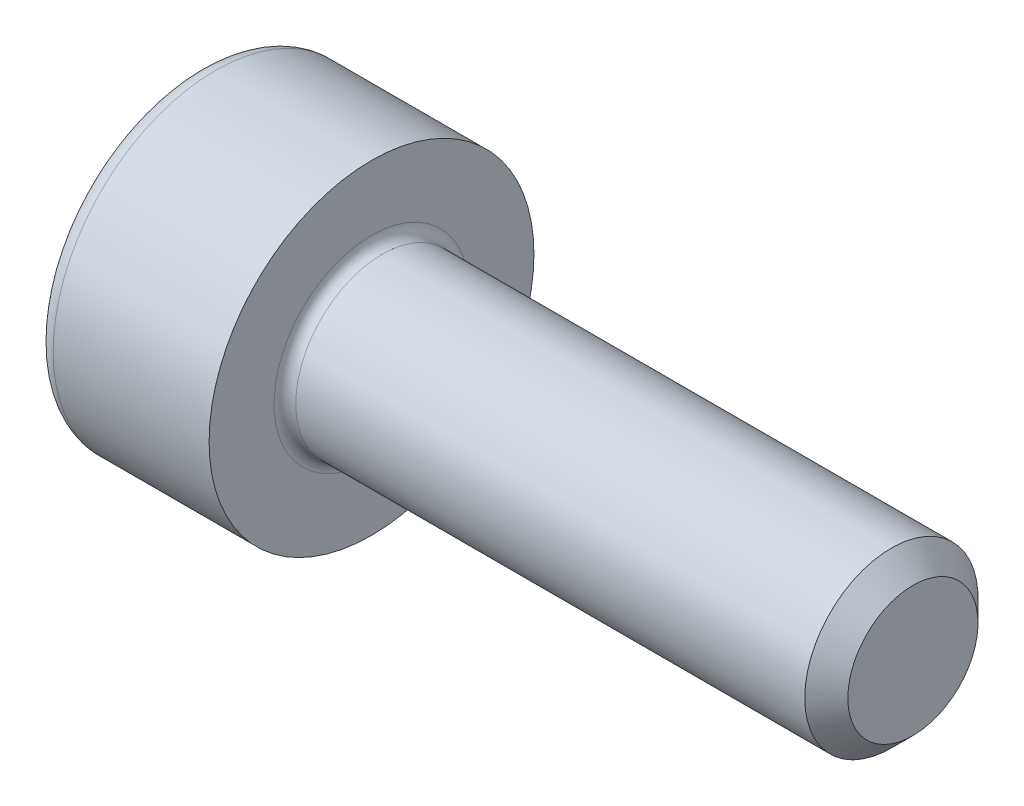
ISO-10303-21;
HEADER;
FILE_DESCRIPTION(('STEP AP214'),'2;1');
FILE_NAME('part.step','',(''),(''),'','','');
FILE_SCHEMA(('AUTOMOTIVE_DESIGN { 1 0 10303 214 1 1 1 1 }'));
ENDSEC;
DATA;
#1=APPLICATION_CONTEXT('core data for automotive mechanical design processes');
#2=APPLICATION_PROTOCOL_DEFINITION('international standard','automotive_design',2000,#1);
#3=PRODUCT_CONTEXT('',#1,'mechanical');
#4=PRODUCT('Part','Part','',(#3));
#5=PRODUCT_RELATED_PRODUCT_CATEGORY('part','',(#4));
#6=PRODUCT_DEFINITION_FORMATION('','',#4);
#7=PRODUCT_DEFINITION_CONTEXT('part definition',#1,'design');
#8=PRODUCT_DEFINITION('design','',#6,#7);
#9=PRODUCT_DEFINITION_SHAPE('','',#8);
#10=(LENGTH_UNIT() NAMED_UNIT(*) SI_UNIT(.MILLI.,.METRE.));
#11=(NAMED_UNIT(*) PLANE_ANGLE_UNIT() SI_UNIT($,.RADIAN.));
#12=(NAMED_UNIT(*) SI_UNIT($,.STERADIAN.) SOLID_ANGLE_UNIT());
#13=UNCERTAINTY_MEASURE_WITH_UNIT(LENGTH_MEASURE(1.E-05),#10,'distance_accuracy_value','');
#14=(GEOMETRIC_REPRESENTATION_CONTEXT(3) GLOBAL_UNCERTAINTY_ASSIGNED_CONTEXT((#13)) GLOBAL_UNIT_ASSIGNED_CONTEXT((#10,
#11,#12)) REPRESENTATION_CONTEXT('',''));
#15=CARTESIAN_POINT('',(0.,0.,0.));
#16=DIRECTION('',(0.,0.,1.));
#17=DIRECTION('',(1.,0.,0.));
#18=AXIS2_PLACEMENT_3D('',#15,#16,#17);
#19=CARTESIAN_POINT('',(0.,0.,0.));
#20=DIRECTION('',(-1.,0.,0.));
#21=DIRECTION('',(0.,0.,1.));
#22=AXIS2_PLACEMENT_3D('',#19,#20,#21);
#23=PLANE('',#22);
#24=DIRECTION('',(0.,-0.499999999999998,0.866025403784439));
#25=VECTOR('',#24,1.);
#26=CARTESIAN_POINT('',(0.,0.877572409168226,0.));
#27=LINE('',#26,#25);
#28=CARTESIAN_POINT('',(0.,0.877572409168226,0.));
#29=VERTEX_POINT('',#28);
#30=CARTESIAN_POINT('',(0.,0.438786204584112,0.759999999999998));
#31=VERTEX_POINT('',#30);
#32=EDGE_CURVE('E261',#29,#31,#27,.T.);
#33=ORIENTED_EDGE('',*,*,#32,.T.);
#34=DIRECTION('',(0.,1.,0.));
#35=VECTOR('',#34,1.);
#36=CARTESIAN_POINT('',(0.,-0.43878620458412,0.76));
#37=LINE('',#36,#35);
#38=CARTESIAN_POINT('',(0.,-0.43878620458412,0.76));
#39=VERTEX_POINT('',#38);
#40=EDGE_CURVE('E133',#39,#31,#37,.T.);
#41=ORIENTED_EDGE('',*,*,#40,.F.);
#42=DIRECTION('',(0.,-0.500000000000001,-0.866025403784438));
#43=VECTOR('',#42,1.);
#44=CARTESIAN_POINT('',(0.,-0.43878620458412,0.76));
#45=LINE('',#44,#43);
#46=CARTESIAN_POINT('',(0.,-0.877572409168237,0.));
#47=VERTEX_POINT('',#46);
#48=EDGE_CURVE('E264',#39,#47,#45,.T.);
#49=ORIENTED_EDGE('',*,*,#48,.T.);
#50=DIRECTION('',(0.,0.499999999999998,-0.866025403784439));
#51=VECTOR('',#50,1.);
#52=CARTESIAN_POINT('',(0.,-0.877572409168237,0.));
#53=LINE('',#52,#51);
#54=CARTESIAN_POINT('',(0.,-0.438786204584122,-0.760000000000002));
#55=VERTEX_POINT('',#54);
#56=EDGE_CURVE('E267',#47,#55,#53,.T.);
#57=ORIENTED_EDGE('',*,*,#56,.T.);
#58=DIRECTION('',(0.,-1.,0.));
#59=VECTOR('',#58,1.);
#60=CARTESIAN_POINT('',(0.,0.438786204584109,-0.760000000000003));
#61=LINE('',#60,#59);
#62=CARTESIAN_POINT('',(0.,0.438786204584109,-0.760000000000003));
#63=VERTEX_POINT('',#62);
#64=EDGE_CURVE('E270',#63,#55,#61,.T.);
#65=ORIENTED_EDGE('',*,*,#64,.F.);
#66=DIRECTION('',(0.,-0.500000000000001,-0.866025403784438));
#67=VECTOR('',#66,1.);
#68=CARTESIAN_POINT('',(0.,0.877572409168226,0.));
#69=LINE('',#68,#67);
#70=EDGE_CURVE('E128',#29,#63,#69,.T.);
#71=ORIENTED_EDGE('',*,*,#70,.F.);
#72=EDGE_LOOP('',(#33,#41,#49,#57,#65,#71));
#73=FACE_BOUND('',#72,.T.);
#74=CARTESIAN_POINT('',(0.,0.,0.));
#75=DIRECTION('',(-1.,0.,0.));
#76=DIRECTION('',(0.,0.,1.));
#77=AXIS2_PLACEMENT_3D('',#74,#75,#76);
#78=CIRCLE('',#77,1.34);
#79=CARTESIAN_POINT('',(0.,0.,1.34));
#80=VERTEX_POINT('',#79);
#81=EDGE_CURVE('E45',#80,#80,#78,.T.);
#82=ORIENTED_EDGE('',*,*,#81,.T.);
#83=EDGE_LOOP('',(#82));
#84=FACE_BOUND('',#83,.T.);
#85=ADVANCED_FACE('F37',(#73,#84),#23,.T.);
#86=CARTESIAN_POINT('',(-31.75,0.,0.));
#87=DIRECTION('',(-1.,0.,0.));
#88=DIRECTION('',(0.,0.,1.));
#89=AXIS2_PLACEMENT_3D('',#86,#87,#88);
#90=CYLINDRICAL_SURFACE('',#89,1.5);
#91=CARTESIAN_POINT('',(0.16,0.,0.));
#92=DIRECTION('',(-1.,0.,0.));
#93=DIRECTION('',(0.,0.,1.));
#94=AXIS2_PLACEMENT_3D('',#91,#92,#93);
#95=CIRCLE('',#94,1.5);
#96=CARTESIAN_POINT('',(0.16,0.,1.5));
#97=VERTEX_POINT('',#96);
#98=EDGE_CURVE('E11',#97,#97,#95,.F.);
#99=ORIENTED_EDGE('',*,*,#98,.T.);
#100=EDGE_LOOP('',(#99));
#101=FACE_BOUND('',#100,.T.);
#102=CARTESIAN_POINT('',(1.6,0.,0.));
#103=DIRECTION('',(-1.,0.,0.));
#104=DIRECTION('',(0.,0.,1.));
#105=AXIS2_PLACEMENT_3D('',#102,#103,#104);
#106=CIRCLE('',#105,1.5);
#107=CARTESIAN_POINT('',(1.6,0.,1.5));
#108=VERTEX_POINT('',#107);
#109=EDGE_CURVE('E151',#108,#108,#106,.T.);
#110=ORIENTED_EDGE('',*,*,#109,.T.);
#111=EDGE_LOOP('',(#110));
#112=FACE_BOUND('',#111,.T.);
#113=ADVANCED_FACE('F175',(#101,#112),#90,.T.);
#114=CARTESIAN_POINT('',(1.6,1.5,0.));
#115=DIRECTION('',(1.,0.,0.));
#116=DIRECTION('',(0.,0.,-1.));
#117=AXIS2_PLACEMENT_3D('',#114,#115,#116);
#118=PLANE('',#117);
#119=CARTESIAN_POINT('',(1.6,0.,0.));
#120=DIRECTION('',(1.,0.,0.));
#121=DIRECTION('',(0.,0.,-1.));
#122=AXIS2_PLACEMENT_3D('',#119,#120,#121);
#123=CIRCLE('',#122,0.899999999999995);
#124=CARTESIAN_POINT('',(1.6,0.,-0.899999999999995));
#125=VERTEX_POINT('',#124);
#126=EDGE_CURVE('E154',#125,#125,#123,.F.);
#127=ORIENTED_EDGE('',*,*,#126,.T.);
#128=EDGE_LOOP('',(#127));
#129=FACE_BOUND('',#128,.T.);
#130=ORIENTED_EDGE('',*,*,#109,.F.);
#131=EDGE_LOOP('',(#130));
#132=FACE_BOUND('',#131,.T.);
#133=ADVANCED_FACE('F181',(#129,#132),#118,.T.);
#134=CARTESIAN_POINT('',(-31.75,0.,0.));
#135=DIRECTION('',(-1.,0.,0.));
#136=DIRECTION('',(0.,0.,1.));
#137=AXIS2_PLACEMENT_3D('',#134,#135,#136);
#138=CYLINDRICAL_SURFACE('',#137,0.799999999999995);
#139=CARTESIAN_POINT('',(1.7,0.,0.));
#140=DIRECTION('',(1.,0.,0.));
#141=DIRECTION('',(0.,0.,-1.));
#142=AXIS2_PLACEMENT_3D('',#139,#140,#141);
#143=CIRCLE('',#142,0.799999999999995);
#144=CARTESIAN_POINT('',(1.7,0.,-0.799999999999995));
#145=VERTEX_POINT('',#144);
#146=EDGE_CURVE('E157',#145,#145,#143,.T.);
#147=ORIENTED_EDGE('',*,*,#146,.T.);
#148=EDGE_LOOP('',(#147));
#149=FACE_BOUND('',#148,.T.);
#150=CARTESIAN_POINT('',(6.40099999999999,0.,0.));
#151=DIRECTION('',(-1.,0.,0.));
#152=DIRECTION('',(0.,0.,1.));
#153=AXIS2_PLACEMENT_3D('',#150,#151,#152);
#154=CIRCLE('',#153,0.799999999999991);
#155=CARTESIAN_POINT('',(6.40099999999999,0.,0.799999999999991));
#156=VERTEX_POINT('',#155);
#157=EDGE_CURVE('E148',#156,#156,#154,.T.);
#158=ORIENTED_EDGE('',*,*,#157,.T.);
#159=EDGE_LOOP('',(#158));
#160=FACE_BOUND('',#159,.T.);
#161=ADVANCED_FACE('F187',(#149,#160),#138,.T.);
#162=CARTESIAN_POINT('',(6.6,0.,0.));
#163=DIRECTION('',(-1.,0.,0.));
#164=DIRECTION('',(0.,0.,1.));
#165=AXIS2_PLACEMENT_3D('',#162,#163,#164);
#166=CONICAL_SURFACE('',#165,0.601,0.785398163397396);
#167=ORIENTED_EDGE('',*,*,#157,.F.);
#168=EDGE_LOOP('',(#167));
#169=FACE_BOUND('',#168,.T.);
#170=CARTESIAN_POINT('',(6.6,0.,0.));
#171=DIRECTION('',(-1.,0.,0.));
#172=DIRECTION('',(0.,0.,1.));
#173=AXIS2_PLACEMENT_3D('',#170,#171,#172);
#174=CIRCLE('',#173,0.601);
#175=CARTESIAN_POINT('',(6.6,0.,0.601));
#176=VERTEX_POINT('',#175);
#177=EDGE_CURVE('E144',#176,#176,#174,.T.);
#178=ORIENTED_EDGE('',*,*,#177,.T.);
#179=EDGE_LOOP('',(#178));
#180=FACE_BOUND('',#179,.T.);
#181=ADVANCED_FACE('F191',(#169,#180),#166,.T.);
#182=CARTESIAN_POINT('',(6.6,0.601,0.));
#183=DIRECTION('',(1.,0.,0.));
#184=DIRECTION('',(0.,0.,-1.));
#185=AXIS2_PLACEMENT_3D('',#182,#183,#184);
#186=PLANE('',#185);
#187=ORIENTED_EDGE('',*,*,#177,.F.);
#188=EDGE_LOOP('',(#187));
#189=FACE_BOUND('',#188,.T.);
#190=ADVANCED_FACE('F171',(#189),#186,.T.);
#191=CARTESIAN_POINT('',(1.7,0.,0.));
#192=DIRECTION('',(1.,0.,0.));
#193=DIRECTION('',(0.,0.,-1.));
#194=AXIS2_PLACEMENT_3D('',#191,#192,#193);
#195=TOROIDAL_SURFACE('',#194,0.899999999999995,0.1);
#196=ORIENTED_EDGE('',*,*,#146,.F.);
#197=EDGE_LOOP('',(#196));
#198=FACE_BOUND('',#197,.T.);
#199=ORIENTED_EDGE('',*,*,#126,.F.);
#200=EDGE_LOOP('',(#199));
#201=FACE_BOUND('',#200,.T.);
#202=ADVANCED_FACE('F164',(#198,#201),#195,.F.);
#203=CARTESIAN_POINT('',(0.16,0.,0.));
#204=DIRECTION('',(-1.,0.,0.));
#205=DIRECTION('',(0.,0.,1.));
#206=AXIS2_PLACEMENT_3D('',#203,#204,#205);
#207=TOROIDAL_SURFACE('',#206,1.34,0.16);
#208=ORIENTED_EDGE('',*,*,#98,.F.);
#209=EDGE_LOOP('',(#208));
#210=FACE_BOUND('',#209,.T.);
#211=ORIENTED_EDGE('',*,*,#81,.F.);
#212=EDGE_LOOP('',(#211));
#213=FACE_BOUND('',#212,.T.);
#214=ADVANCED_FACE('F39',(#210,#213),#207,.T.);
#215=CARTESIAN_POINT('',(0.7,0.877572409168226,0.));
#216=DIRECTION('',(0.,-0.86602540378444,-0.499999999999998));
#217=DIRECTION('',(0.,0.499999999999998,-0.86602540378444));
#218=AXIS2_PLACEMENT_3D('',#215,#216,#217);
#219=PLANE('',#218);
#220=ORIENTED_EDGE('',*,*,#32,.F.);
#221=DIRECTION('',(-1.,0.,0.));
#222=VECTOR('',#221,1.);
#223=CARTESIAN_POINT('',(0.7,0.877572409168226,0.));
#224=LINE('',#223,#222);
#225=CARTESIAN_POINT('',(0.7,0.877572409168226,0.));
#226=VERTEX_POINT('',#225);
#227=EDGE_CURVE('E251',#226,#29,#224,.T.);
#228=ORIENTED_EDGE('',*,*,#227,.F.);
#229=DIRECTION('',(0.,-0.499999999999998,0.866025403784439));
#230=VECTOR('',#229,1.);
#231=CARTESIAN_POINT('',(0.7,0.877572409168226,0.));
#232=LINE('',#231,#230);
#233=CARTESIAN_POINT('',(0.7,0.65817930687617,0.379999999999996));
#234=VERTEX_POINT('',#233);
#235=EDGE_CURVE('E120',#226,#234,#232,.T.);
#236=ORIENTED_EDGE('',*,*,#235,.T.);
#237=CARTESIAN_POINT('',(0.7,0.438786204584112,0.759999999999998));
#238=VERTEX_POINT('',#237);
#239=EDGE_CURVE('E111',#234,#238,#232,.T.);
#240=ORIENTED_EDGE('',*,*,#239,.T.);
#241=DIRECTION('',(-1.,0.,0.));
#242=VECTOR('',#241,1.);
#243=CARTESIAN_POINT('',(0.7,0.438786204584112,0.759999999999998));
#244=LINE('',#243,#242);
#245=EDGE_CURVE('E125',#238,#31,#244,.T.);
#246=ORIENTED_EDGE('',*,*,#245,.T.);
#247=EDGE_LOOP('',(#220,#228,#236,#240,#246));
#248=FACE_BOUND('',#247,.T.);
#249=ADVANCED_FACE('F124',(#248),#219,.T.);
#250=CARTESIAN_POINT('',(0.7,-0.43878620458412,0.76));
#251=DIRECTION('',(0.,0.,1.));
#252=DIRECTION('',(0.,-1.,0.));
#253=AXIS2_PLACEMENT_3D('',#250,#251,#252);
#254=PLANE('',#253);
#255=ORIENTED_EDGE('',*,*,#40,.T.);
#256=ORIENTED_EDGE('',*,*,#245,.F.);
#257=DIRECTION('',(0.,1.,0.));
#258=VECTOR('',#257,1.);
#259=CARTESIAN_POINT('',(0.7,-0.43878620458412,0.76));
#260=LINE('',#259,#258);
#261=CARTESIAN_POINT('',(0.7,0.,0.759999999999999));
#262=VERTEX_POINT('',#261);
#263=EDGE_CURVE('E108',#262,#238,#260,.T.);
#264=ORIENTED_EDGE('',*,*,#263,.F.);
#265=CARTESIAN_POINT('',(0.7,-0.43878620458412,0.76));
#266=VERTEX_POINT('',#265);
#267=EDGE_CURVE('E119',#266,#262,#260,.T.);
#268=ORIENTED_EDGE('',*,*,#267,.F.);
#269=DIRECTION('',(-1.,0.,0.));
#270=VECTOR('',#269,1.);
#271=CARTESIAN_POINT('',(0.7,-0.43878620458412,0.76));
#272=LINE('',#271,#270);
#273=EDGE_CURVE('E135',#266,#39,#272,.T.);
#274=ORIENTED_EDGE('',*,*,#273,.T.);
#275=EDGE_LOOP('',(#255,#256,#264,#268,#274));
#276=FACE_BOUND('',#275,.T.);
#277=ADVANCED_FACE('F130',(#276),#254,.F.);
#278=CARTESIAN_POINT('',(0.7,-0.43878620458412,0.76));
#279=DIRECTION('',(0.,0.866025403784438,-0.500000000000001));
#280=DIRECTION('',(0.,0.500000000000001,0.866025403784438));
#281=AXIS2_PLACEMENT_3D('',#278,#279,#280);
#282=PLANE('',#281);
#283=ORIENTED_EDGE('',*,*,#48,.F.);
#284=ORIENTED_EDGE('',*,*,#273,.F.);
#285=DIRECTION('',(0.,-0.500000000000001,-0.866025403784438));
#286=VECTOR('',#285,1.);
#287=CARTESIAN_POINT('',(0.7,-0.43878620458412,0.76));
#288=LINE('',#287,#286);
#289=CARTESIAN_POINT('',(0.7,-0.658179306876177,0.380000000000003));
#290=VERTEX_POINT('',#289);
#291=EDGE_CURVE('E290',#266,#290,#288,.T.);
#292=ORIENTED_EDGE('',*,*,#291,.T.);
#293=CARTESIAN_POINT('',(0.7,-0.877572409168237,0.));
#294=VERTEX_POINT('',#293);
#295=EDGE_CURVE('E279',#290,#294,#288,.T.);
#296=ORIENTED_EDGE('',*,*,#295,.T.);
#297=DIRECTION('',(-1.,0.,0.));
#298=VECTOR('',#297,1.);
#299=CARTESIAN_POINT('',(0.7,-0.877572409168237,0.));
#300=LINE('',#299,#298);
#301=EDGE_CURVE('E140',#294,#47,#300,.T.);
#302=ORIENTED_EDGE('',*,*,#301,.T.);
#303=EDGE_LOOP('',(#283,#284,#292,#296,#302));
#304=FACE_BOUND('',#303,.T.);
#305=ADVANCED_FACE('F205',(#304),#282,.T.);
#306=CARTESIAN_POINT('',(0.7,-0.877572409168237,0.));
#307=DIRECTION('',(0.,0.86602540378444,0.499999999999998));
#308=DIRECTION('',(0.,-0.499999999999998,0.86602540378444));
#309=AXIS2_PLACEMENT_3D('',#306,#307,#308);
#310=PLANE('',#309);
#311=ORIENTED_EDGE('',*,*,#56,.F.);
#312=ORIENTED_EDGE('',*,*,#301,.F.);
#313=DIRECTION('',(0.,0.499999999999998,-0.866025403784439));
#314=VECTOR('',#313,1.);
#315=CARTESIAN_POINT('',(0.7,-0.877572409168237,0.));
#316=LINE('',#315,#314);
#317=CARTESIAN_POINT('',(0.7,-0.658179306876179,-0.380000000000002));
#318=VERTEX_POINT('',#317);
#319=EDGE_CURVE('E257',#294,#318,#316,.T.);
#320=ORIENTED_EDGE('',*,*,#319,.T.);
#321=CARTESIAN_POINT('',(0.7,-0.438786204584122,-0.760000000000002));
#322=VERTEX_POINT('',#321);
#323=EDGE_CURVE('E289',#318,#322,#316,.T.);
#324=ORIENTED_EDGE('',*,*,#323,.T.);
#325=DIRECTION('',(-1.,0.,0.));
#326=VECTOR('',#325,1.);
#327=CARTESIAN_POINT('',(0.7,-0.438786204584122,-0.760000000000002));
#328=LINE('',#327,#326);
#329=EDGE_CURVE('E250',#322,#55,#328,.T.);
#330=ORIENTED_EDGE('',*,*,#329,.T.);
#331=EDGE_LOOP('',(#311,#312,#320,#324,#330));
#332=FACE_BOUND('',#331,.T.);
#333=ADVANCED_FACE('F208',(#332),#310,.T.);
#334=CARTESIAN_POINT('',(0.7,0.438786204584109,-0.760000000000003));
#335=DIRECTION('',(0.,0.,-1.));
#336=DIRECTION('',(0.,1.,0.));
#337=AXIS2_PLACEMENT_3D('',#334,#335,#336);
#338=PLANE('',#337);
#339=ORIENTED_EDGE('',*,*,#64,.T.);
#340=ORIENTED_EDGE('',*,*,#329,.F.);
#341=DIRECTION('',(0.,-1.,0.));
#342=VECTOR('',#341,1.);
#343=CARTESIAN_POINT('',(0.7,0.438786204584109,-0.760000000000003));
#344=LINE('',#343,#342);
#345=CARTESIAN_POINT('',(0.7,0.,-0.76));
#346=VERTEX_POINT('',#345);
#347=EDGE_CURVE('E254',#346,#322,#344,.T.);
#348=ORIENTED_EDGE('',*,*,#347,.F.);
#349=CARTESIAN_POINT('',(0.7,0.438786204584109,-0.760000000000003));
#350=VERTEX_POINT('',#349);
#351=EDGE_CURVE('E52',#350,#346,#344,.T.);
#352=ORIENTED_EDGE('',*,*,#351,.F.);
#353=DIRECTION('',(-1.,0.,0.));
#354=VECTOR('',#353,1.);
#355=CARTESIAN_POINT('',(0.7,0.438786204584109,-0.760000000000003));
#356=LINE('',#355,#354);
#357=EDGE_CURVE('E247',#350,#63,#356,.T.);
#358=ORIENTED_EDGE('',*,*,#357,.T.);
#359=EDGE_LOOP('',(#339,#340,#348,#352,#358));
#360=FACE_BOUND('',#359,.T.);
#361=ADVANCED_FACE('F212',(#360),#338,.F.);
#362=CARTESIAN_POINT('',(0.7,0.877572409168226,0.));
#363=DIRECTION('',(0.,0.866025403784438,-0.500000000000001));
#364=DIRECTION('',(0.,0.500000000000001,0.866025403784438));
#365=AXIS2_PLACEMENT_3D('',#362,#363,#364);
#366=PLANE('',#365);
#367=ORIENTED_EDGE('',*,*,#70,.T.);
#368=ORIENTED_EDGE('',*,*,#357,.F.);
#369=DIRECTION('',(0.,-0.500000000000001,-0.866025403784438));
#370=VECTOR('',#369,1.);
#371=CARTESIAN_POINT('',(0.7,0.877572409168226,0.));
#372=LINE('',#371,#370);
#373=CARTESIAN_POINT('',(0.7,0.65817930687617,-0.379999999999999));
#374=VERTEX_POINT('',#373);
#375=EDGE_CURVE('E237',#374,#350,#372,.T.);
#376=ORIENTED_EDGE('',*,*,#375,.F.);
#377=EDGE_CURVE('E243',#226,#374,#372,.T.);
#378=ORIENTED_EDGE('',*,*,#377,.F.);
#379=ORIENTED_EDGE('',*,*,#227,.T.);
#380=EDGE_LOOP('',(#367,#368,#376,#378,#379));
#381=FACE_BOUND('',#380,.T.);
#382=ADVANCED_FACE('F216',(#381),#366,.F.);
#383=CARTESIAN_POINT('',(0.7,1.31635861375234,-0.760000000000004));
#384=DIRECTION('',(1.,0.,0.));
#385=DIRECTION('',(0.,0.,-1.));
#386=AXIS2_PLACEMENT_3D('',#383,#384,#385);
#387=PLANE('',#386);
#388=ORIENTED_EDGE('',*,*,#347,.T.);
#389=ORIENTED_EDGE('',*,*,#323,.F.);
#390=CARTESIAN_POINT('',(0.7,0.,0.));
#391=DIRECTION('',(-1.,0.,0.));
#392=DIRECTION('',(0.,0.,1.));
#393=AXIS2_PLACEMENT_3D('',#390,#391,#392);
#394=CIRCLE('',#393,0.76);
#395=EDGE_CURVE('E285',#346,#318,#394,.T.);
#396=ORIENTED_EDGE('',*,*,#395,.F.);
#397=EDGE_LOOP('',(#388,#389,#396));
#398=FACE_BOUND('',#397,.T.);
#399=ADVANCED_FACE('F220',(#398),#387,.F.);
#400=ORIENTED_EDGE('',*,*,#319,.F.);
#401=ORIENTED_EDGE('',*,*,#295,.F.);
#402=EDGE_CURVE('E138',#318,#290,#394,.T.);
#403=ORIENTED_EDGE('',*,*,#402,.F.);
#404=EDGE_LOOP('',(#400,#401,#403));
#405=FACE_BOUND('',#404,.T.);
#406=ADVANCED_FACE('F223',(#405),#387,.F.);
#407=ORIENTED_EDGE('',*,*,#291,.F.);
#408=ORIENTED_EDGE('',*,*,#267,.T.);
#409=EDGE_CURVE('E134',#290,#262,#394,.T.);
#410=ORIENTED_EDGE('',*,*,#409,.F.);
#411=EDGE_LOOP('',(#407,#408,#410));
#412=FACE_BOUND('',#411,.T.);
#413=ADVANCED_FACE('F228',(#412),#387,.F.);
#414=ORIENTED_EDGE('',*,*,#263,.T.);
#415=ORIENTED_EDGE('',*,*,#239,.F.);
#416=EDGE_CURVE('E114',#262,#234,#394,.T.);
#417=ORIENTED_EDGE('',*,*,#416,.F.);
#418=EDGE_LOOP('',(#414,#415,#417));
#419=FACE_BOUND('',#418,.T.);
#420=ADVANCED_FACE('F110',(#419),#387,.F.);
#421=ORIENTED_EDGE('',*,*,#235,.F.);
#422=ORIENTED_EDGE('',*,*,#377,.T.);
#423=EDGE_CURVE('E145',#234,#374,#394,.T.);
#424=ORIENTED_EDGE('',*,*,#423,.F.);
#425=EDGE_LOOP('',(#421,#422,#424));
#426=FACE_BOUND('',#425,.T.);
#427=ADVANCED_FACE('F231',(#426),#387,.F.);
#428=ORIENTED_EDGE('',*,*,#375,.T.);
#429=ORIENTED_EDGE('',*,*,#351,.T.);
#430=EDGE_CURVE('E240',#374,#346,#394,.T.);
#431=ORIENTED_EDGE('',*,*,#430,.F.);
#432=EDGE_LOOP('',(#428,#429,#431));
#433=FACE_BOUND('',#432,.T.);
#434=ADVANCED_FACE('F201',(#433),#387,.F.);
#435=CARTESIAN_POINT('',(0.7,0.,0.));
#436=DIRECTION('',(-1.,0.,0.));
#437=DIRECTION('',(0.,0.,1.));
#438=AXIS2_PLACEMENT_3D('',#435,#436,#437);
#439=CONICAL_SURFACE('',#438,0.76,1.0471975511966);
#440=CARTESIAN_POINT('',(1.13878620458412,0.,0.));
#441=VERTEX_POINT('',#440);
#442=VERTEX_LOOP('',#441);
#443=FACE_BOUND('',#442,.T.);
#444=ORIENTED_EDGE('',*,*,#416,.T.);
#445=ORIENTED_EDGE('',*,*,#423,.T.);
#446=ORIENTED_EDGE('',*,*,#430,.T.);
#447=ORIENTED_EDGE('',*,*,#395,.T.);
#448=ORIENTED_EDGE('',*,*,#402,.T.);
#449=ORIENTED_EDGE('',*,*,#409,.T.);
#450=EDGE_LOOP('',(#444,#445,#446,#447,#448,#449));
#451=FACE_BOUND('',#450,.T.);
#452=ADVANCED_FACE('F199',(#443,#451),#439,.F.);
#453=CLOSED_SHELL('',(#85,#113,#133,#161,#181,#190,#202,#214,#249,#277,#305,#333,#361,#382,#399,
#406,#413,#420,#427,#434,#452));
#454=MANIFOLD_SOLID_BREP('B2',#453);
#455=ADVANCED_BREP_SHAPE_REPRESENTATION('',(#18,#454),#14);
#456=SHAPE_DEFINITION_REPRESENTATION(#9,#455);
ENDSEC;
END-ISO-10303-21;
